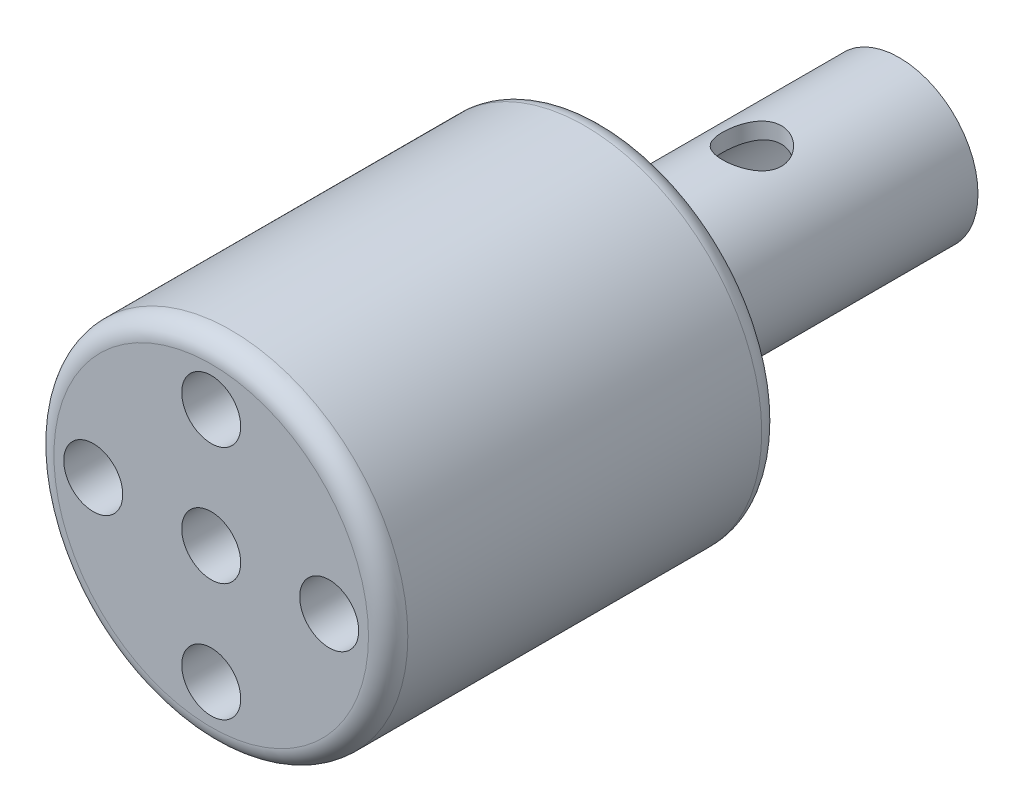
ISO-10303-21;
HEADER;
FILE_DESCRIPTION(('STEP AP214'),'2;1');
FILE_NAME('part.step','',(''),(''),'','','');
FILE_SCHEMA(('AUTOMOTIVE_DESIGN { 1 0 10303 214 1 1 1 1 }'));
ENDSEC;
DATA;
#1=APPLICATION_CONTEXT('core data for automotive mechanical design processes');
#2=APPLICATION_PROTOCOL_DEFINITION('international standard','automotive_design',2000,#1);
#3=PRODUCT_CONTEXT('',#1,'mechanical');
#4=PRODUCT('Part','Part','',(#3));
#5=PRODUCT_RELATED_PRODUCT_CATEGORY('part','',(#4));
#6=PRODUCT_DEFINITION_FORMATION('','',#4);
#7=PRODUCT_DEFINITION_CONTEXT('part definition',#1,'design');
#8=PRODUCT_DEFINITION('design','',#6,#7);
#9=PRODUCT_DEFINITION_SHAPE('','',#8);
#10=(LENGTH_UNIT() NAMED_UNIT(*) SI_UNIT(.MILLI.,.METRE.));
#11=(NAMED_UNIT(*) PLANE_ANGLE_UNIT() SI_UNIT($,.RADIAN.));
#12=(NAMED_UNIT(*) SI_UNIT($,.STERADIAN.) SOLID_ANGLE_UNIT());
#13=UNCERTAINTY_MEASURE_WITH_UNIT(LENGTH_MEASURE(1.E-05),#10,'distance_accuracy_value','');
#14=(GEOMETRIC_REPRESENTATION_CONTEXT(3) GLOBAL_UNCERTAINTY_ASSIGNED_CONTEXT((#13)) GLOBAL_UNIT_ASSIGNED_CONTEXT((#10,
#11,#12)) REPRESENTATION_CONTEXT('',''));
#15=CARTESIAN_POINT('',(0.,0.,0.));
#16=DIRECTION('',(0.,0.,1.));
#17=DIRECTION('',(1.,0.,0.));
#18=AXIS2_PLACEMENT_3D('',#15,#16,#17);
#19=CARTESIAN_POINT('',(0.,0.,-15.));
#20=DIRECTION('',(0.,0.,1.));
#21=DIRECTION('',(1.,0.,0.));
#22=AXIS2_PLACEMENT_3D('',#19,#20,#21);
#23=CYLINDRICAL_SURFACE('',#22,4.);
#24=CARTESIAN_POINT('',(0.,0.,-0.25));
#25=DIRECTION('',(0.,0.,1.));
#26=DIRECTION('',(1.,0.,0.));
#27=AXIS2_PLACEMENT_3D('',#24,#25,#26);
#28=CIRCLE('',#27,4.);
#29=CARTESIAN_POINT('',(4.,0.,-0.25));
#30=VERTEX_POINT('',#29);
#31=EDGE_CURVE('E146',#30,#30,#28,.F.);
#32=ORIENTED_EDGE('',*,*,#31,.T.);
#33=EDGE_LOOP('',(#32));
#34=FACE_BOUND('',#33,.T.);
#35=CARTESIAN_POINT('',(0.,0.,-15.));
#36=DIRECTION('',(0.,0.,-1.));
#37=DIRECTION('',(-1.,0.,0.));
#38=AXIS2_PLACEMENT_3D('',#35,#36,#37);
#39=CIRCLE('',#38,4.);
#40=CARTESIAN_POINT('',(-4.,0.,-15.));
#41=VERTEX_POINT('',#40);
#42=EDGE_CURVE('E173',#41,#41,#39,.T.);
#43=ORIENTED_EDGE('',*,*,#42,.F.);
#44=EDGE_LOOP('',(#43));
#45=FACE_BOUND('',#44,.T.);
#46=CARTESIAN_POINT('',(0.,-4.,-9.));
#47=CARTESIAN_POINT('',(0.0812350589378533,-4.00000217456151,-9.00000290230311));
#48=CARTESIAN_POINT('',(0.162450241781792,-3.99750379283184,-8.99338023975162));
#49=CARTESIAN_POINT('',(0.322453452352361,-3.98778696006928,-8.96717180473007));
#50=CARTESIAN_POINT('',(0.401241827987616,-3.98056918893993,-8.94758789952943));
#51=CARTESIAN_POINT('',(0.55406078499088,-3.96218832391545,-8.89624699822824));
#52=CARTESIAN_POINT('',(0.628100224162279,-3.9510328434944,-8.86451348317821));
#53=CARTESIAN_POINT('',(0.769799310160255,-3.92588767765353,-8.78989358698418));
#54=CARTESIAN_POINT('',(0.83745723917788,-3.91189723227548,-8.74700421445585));
#55=CARTESIAN_POINT('',(0.967346417045825,-3.88186246971217,-8.64938746892909));
#56=CARTESIAN_POINT('',(1.02927073015119,-3.86576002583566,-8.5942697377406));
#57=CARTESIAN_POINT('',(1.14324421474363,-3.83360220871327,-8.47458956534116));
#58=CARTESIAN_POINT('',(1.19529036359203,-3.81754685135033,-8.41002424391213));
#59=CARTESIAN_POINT('',(1.28998202215985,-3.78662470617731,-8.27028253247679));
#60=CARTESIAN_POINT('',(1.3321939319576,-3.77182648820818,-8.19479563345418));
#61=CARTESIAN_POINT('',(1.40318646334084,-3.74599860237433,-8.03715164583148));
#62=CARTESIAN_POINT('',(1.43197244961239,-3.73496742975881,-7.9549972368449));
#63=CARTESIAN_POINT('',(1.47408431017549,-3.71854412824136,-7.7898832597418));
#64=CARTESIAN_POINT('',(1.48799593218558,-3.71293924350838,-7.70709496156456));
#65=CARTESIAN_POINT('',(1.50179556531648,-3.70738061461215,-7.54018384200616));
#66=CARTESIAN_POINT('',(1.50168936802631,-3.70742453659305,-7.45606158612553));
#67=CARTESIAN_POINT('',(1.48790429610018,-3.71297511632055,-7.29423047478704));
#68=CARTESIAN_POINT('',(1.47503808509004,-3.71815468871122,-7.21643909395582));
#69=CARTESIAN_POINT('',(1.4374416786833,-3.73284938059529,-7.06421284959468));
#70=CARTESIAN_POINT('',(1.41270969663258,-3.74236515298863,-6.98977849338612));
#71=CARTESIAN_POINT('',(1.35163748571904,-3.76485702190253,-6.84472293227177));
#72=CARTESIAN_POINT('',(1.31508648737101,-3.77789517988166,-6.7742005138787));
#73=CARTESIAN_POINT('',(1.23156073762698,-3.80594210139319,-6.64005426240903));
#74=CARTESIAN_POINT('',(1.18458238728897,-3.82095154457158,-6.5764328224803));
#75=CARTESIAN_POINT('',(1.07781780766549,-3.85248038859113,-6.45339633634912));
#76=CARTESIAN_POINT('',(1.01738298716956,-3.86903347455671,-6.39455135925191));
#77=CARTESIAN_POINT('',(0.887312590819021,-3.90091728164085,-6.2876620337942));
#78=CARTESIAN_POINT('',(0.817675603497365,-3.91624781465952,-6.23961934539433));
#79=CARTESIAN_POINT('',(0.66972343699242,-3.9442639480908,-6.15506960293748));
#80=CARTESIAN_POINT('',(0.591290713844719,-3.95690498259616,-6.11875241877894));
#81=CARTESIAN_POINT('',(0.428836850524583,-3.97778718326962,-6.06001739572996));
#82=CARTESIAN_POINT('',(0.344818210845768,-3.98603030341493,-6.03759338343888));
#83=CARTESIAN_POINT('',(0.178375243148666,-3.99684443228065,-6.00837721245806));
#84=CARTESIAN_POINT('',(0.0961036195622103,-3.99969369025686,-6.00081739361749));
#85=CARTESIAN_POINT('',(-0.0685724752550234,-4.00025893700126,-5.99930893610008));
#86=CARTESIAN_POINT('',(-0.150976912983372,-3.99797606386863,-6.00535727968322));
#87=CARTESIAN_POINT('',(-0.310262048561858,-3.98871709772643,-6.03031004230867));
#88=CARTESIAN_POINT('',(-0.387233328007335,-3.98192470962305,-6.04871154373708));
#89=CARTESIAN_POINT('',(-0.53694175495722,-3.96451477091717,-6.09718607254732));
#90=CARTESIAN_POINT('',(-0.609678350347534,-3.9538967228203,-6.12726061794804));
#91=CARTESIAN_POINT('',(-0.751247765110155,-3.92949624407682,-6.19918641243948));
#92=CARTESIAN_POINT('',(-0.819903083557795,-3.91563000209348,-6.24135772922339));
#93=CARTESIAN_POINT('',(-0.949392711726625,-3.88626671564664,-6.33591810317156));
#94=CARTESIAN_POINT('',(-1.01022412027045,-3.87076907009516,-6.38831093254515));
#95=CARTESIAN_POINT('',(-1.12603079874454,-3.8387332949099,-6.50540412212427));
#96=CARTESIAN_POINT('',(-1.18046154123568,-3.82218696503729,-6.5706421827727));
#97=CARTESIAN_POINT('',(-1.27771050031903,-3.79078815746854,-6.70965138470766));
#98=CARTESIAN_POINT('',(-1.32052767414518,-3.77593583194399,-6.7834232913885));
#99=CARTESIAN_POINT('',(-1.39337773518998,-3.74966829822463,-6.93801598677231));
#100=CARTESIAN_POINT('',(-1.42335685446918,-3.73826760328493,-7.01886474591044));
#101=CARTESIAN_POINT('',(-1.46907883466889,-3.72054032891005,-7.18500976368782));
#102=CARTESIAN_POINT('',(-1.48483050305535,-3.71421061057491,-7.27030323619812));
#103=CARTESIAN_POINT('',(-1.50086347097839,-3.70775894792573,-7.43701615954111));
#104=CARTESIAN_POINT('',(-1.50207331495837,-3.70726444523341,-7.51833263171688));
#105=CARTESIAN_POINT('',(-1.49136715641593,-3.71158412745292,-7.67994531627616));
#106=CARTESIAN_POINT('',(-1.47945239850123,-3.71639780898899,-7.76024162467158));
#107=CARTESIAN_POINT('',(-1.44355815630242,-3.73048141585432,-7.91504722671655));
#108=CARTESIAN_POINT('',(-1.41995798316524,-3.73961085376663,-7.98965834624534));
#109=CARTESIAN_POINT('',(-1.3616969677992,-3.76121548297845,-8.13390550849442));
#110=CARTESIAN_POINT('',(-1.32703332944945,-3.77369151995215,-8.20354028807014));
#111=CARTESIAN_POINT('',(-1.24552075938154,-3.80139723903965,-8.33982678969763));
#112=CARTESIAN_POINT('',(-1.1981283280301,-3.81673698440964,-8.40613079679991));
#113=CARTESIAN_POINT('',(-1.09334485729906,-3.84806246757177,-8.5301415609712));
#114=CARTESIAN_POINT('',(-1.03595064012808,-3.86404840943145,-8.58784557478675));
#115=CARTESIAN_POINT('',(-0.909080396784623,-3.89590424609881,-8.69620195582184));
#116=CARTESIAN_POINT('',(-0.839118644212992,-3.91172104900645,-8.74630375343467));
#117=CARTESIAN_POINT('',(-0.691213223200821,-3.94054514457031,-8.83402265527655));
#118=CARTESIAN_POINT('',(-0.613268934090622,-3.95355221851559,-8.87163878773637));
#119=CARTESIAN_POINT('',(-0.447999082002312,-3.9757429260668,-8.93437682904833));
#120=CARTESIAN_POINT('',(-0.360413422234208,-3.98473657158356,-8.9588870646019));
#121=CARTESIAN_POINT('',(-0.181875733606382,-3.99686242179587,-8.99169295992068));
#122=CARTESIAN_POINT('',(-0.0909254163648587,-3.99999756603967,-8.99999675148732));
#123=CARTESIAN_POINT('',(0.,-4.,-9.));
#124=B_SPLINE_CURVE_WITH_KNOTS('',3,(#46,#47,#48,#49,#50,#51,#52,#53,#54,#55,#56,#57,#58,#59,
#60,#61,#62,#63,#64,#65,#66,#67,#68,#69,#70,#71,#72,#73,#74,#75,#76,#77,#78,#79,#80,#81,#82,#83,
#84,#85,#86,#87,#88,#89,#90,#91,#92,#93,#94,#95,#96,#97,#98,#99,#100,#101,#102,#103,#104,#105,
#106,#107,#108,#109,#110,#111,#112,#113,#114,#115,#116,#117,#118,#119,#120,#121,#122,#123),
.UNSPECIFIED.,.T.,.F.,(4,2,2,2,2,2,2,2,2,2,2,2,2,2,2,2,2,2,2,2,2,2,2,2,2,2,2,2,2,2,2,2,2,2,2,2,
2,2,4),(0.,0.243369801560559,0.48670454953046,0.729571369213574,0.972503379609489,
1.22473618582715,1.47704604925622,1.73896674501658,2.00078269352134,2.25185874416901,
2.50283106079707,2.73878345119971,2.97477138060589,3.21522408387018,3.45575990744258,
3.71246153335813,3.96920257905066,4.22991375286075,4.49050899698846,4.73725019635925,
4.9839366839052,5.2211443792384,5.45838293254453,5.70259221859599,5.94689180019868,
6.20536519455657,6.46386178920141,6.72343066727204,6.98283874956507,7.22558763480252,
7.46831350211259,7.70363142426533,7.93900886656506,8.18672471884271,8.43451941997062,
8.69572329654039,8.95694749805102,9.22948515032042,9.50188601796127),.UNSPECIFIED.);
#125=CARTESIAN_POINT('',(0.,-4.,-9.));
#126=VERTEX_POINT('',#125);
#127=EDGE_CURVE('E78',#126,#126,#124,.T.);
#128=ORIENTED_EDGE('',*,*,#127,.F.);
#129=EDGE_LOOP('',(#128));
#130=FACE_BOUND('',#129,.T.);
#131=CARTESIAN_POINT('',(0.,4.,-9.));
#132=CARTESIAN_POINT('',(-0.0812350589378524,4.00000217456151,-9.00000290230311));
#133=CARTESIAN_POINT('',(-0.162450241781792,3.99750379283184,-8.99338023975162));
#134=CARTESIAN_POINT('',(-0.32245345235236,3.98778696006928,-8.96717180473007));
#135=CARTESIAN_POINT('',(-0.401241827987615,3.98056918893993,-8.94758789952943));
#136=CARTESIAN_POINT('',(-0.554060784990878,3.96218832391545,-8.89624699822824));
#137=CARTESIAN_POINT('',(-0.628100224162277,3.9510328434944,-8.86451348317821));
#138=CARTESIAN_POINT('',(-0.769799310160253,3.92588767765353,-8.78989358698418));
#139=CARTESIAN_POINT('',(-0.837457239177879,3.91189723227548,-8.74700421445585));
#140=CARTESIAN_POINT('',(-0.967346417045825,3.88186246971217,-8.64938746892909));
#141=CARTESIAN_POINT('',(-1.02927073015119,3.86576002583566,-8.5942697377406));
#142=CARTESIAN_POINT('',(-1.14324421474363,3.83360220871327,-8.47458956534116));
#143=CARTESIAN_POINT('',(-1.19529036359203,3.81754685135033,-8.41002424391213));
#144=CARTESIAN_POINT('',(-1.28998202215985,3.78662470617731,-8.27028253247679));
#145=CARTESIAN_POINT('',(-1.3321939319576,3.77182648820818,-8.19479563345418));
#146=CARTESIAN_POINT('',(-1.40318646334084,3.74599860237433,-8.03715164583148));
#147=CARTESIAN_POINT('',(-1.43197244961239,3.73496742975881,-7.9549972368449));
#148=CARTESIAN_POINT('',(-1.47408431017549,3.71854412824136,-7.7898832597418));
#149=CARTESIAN_POINT('',(-1.48799593218558,3.71293924350838,-7.70709496156456));
#150=CARTESIAN_POINT('',(-1.50179556531648,3.70738061461215,-7.54018384200616));
#151=CARTESIAN_POINT('',(-1.5016893680263,3.70742453659305,-7.45606158612553));
#152=CARTESIAN_POINT('',(-1.48790429610018,3.71297511632055,-7.29423047478704));
#153=CARTESIAN_POINT('',(-1.47503808509003,3.71815468871122,-7.21643909395582));
#154=CARTESIAN_POINT('',(-1.4374416786833,3.73284938059529,-7.06421284959468));
#155=CARTESIAN_POINT('',(-1.41270969663258,3.74236515298863,-6.98977849338612));
#156=CARTESIAN_POINT('',(-1.35163748571904,3.76485702190253,-6.84472293227177));
#157=CARTESIAN_POINT('',(-1.31508648737101,3.77789517988166,-6.7742005138787));
#158=CARTESIAN_POINT('',(-1.23156073762698,3.80594210139319,-6.64005426240903));
#159=CARTESIAN_POINT('',(-1.18458238728897,3.82095154457158,-6.5764328224803));
#160=CARTESIAN_POINT('',(-1.07781780766549,3.85248038859113,-6.45339633634912));
#161=CARTESIAN_POINT('',(-1.01738298716955,3.86903347455671,-6.39455135925191));
#162=CARTESIAN_POINT('',(-0.88731259081902,3.90091728164085,-6.2876620337942));
#163=CARTESIAN_POINT('',(-0.817675603497363,3.91624781465952,-6.23961934539433));
#164=CARTESIAN_POINT('',(-0.669723436992419,3.9442639480908,-6.15506960293748));
#165=CARTESIAN_POINT('',(-0.591290713844718,3.95690498259616,-6.11875241877894));
#166=CARTESIAN_POINT('',(-0.428836850524582,3.97778718326962,-6.06001739572996));
#167=CARTESIAN_POINT('',(-0.344818210845767,3.98603030341493,-6.03759338343888));
#168=CARTESIAN_POINT('',(-0.178375243148665,3.99684443228065,-6.00837721245806));
#169=CARTESIAN_POINT('',(-0.0961036195622087,3.99969369025686,-6.00081739361749));
#170=CARTESIAN_POINT('',(0.0685724752550248,4.00025893700126,-5.99930893610008));
#171=CARTESIAN_POINT('',(0.150976912983373,3.99797606386863,-6.00535727968322));
#172=CARTESIAN_POINT('',(0.31026204856186,3.98871709772643,-6.03031004230867));
#173=CARTESIAN_POINT('',(0.387233328007337,3.98192470962305,-6.04871154373709));
#174=CARTESIAN_POINT('',(0.536941754957222,3.96451477091717,-6.09718607254732));
#175=CARTESIAN_POINT('',(0.609678350347535,3.9538967228203,-6.12726061794804));
#176=CARTESIAN_POINT('',(0.751247765110156,3.92949624407681,-6.19918641243947));
#177=CARTESIAN_POINT('',(0.819903083557796,3.91563000209348,-6.24135772922339));
#178=CARTESIAN_POINT('',(0.949392711726626,3.88626671564664,-6.33591810317156));
#179=CARTESIAN_POINT('',(1.01022412027045,3.87076907009516,-6.38831093254515));
#180=CARTESIAN_POINT('',(1.12603079874454,3.8387332949099,-6.50540412212427));
#181=CARTESIAN_POINT('',(1.18046154123569,3.82218696503729,-6.5706421827727));
#182=CARTESIAN_POINT('',(1.27771050031903,3.79078815746854,-6.70965138470766));
#183=CARTESIAN_POINT('',(1.32052767414518,3.77593583194399,-6.7834232913885));
#184=CARTESIAN_POINT('',(1.39337773518998,3.74966829822463,-6.93801598677231));
#185=CARTESIAN_POINT('',(1.42335685446918,3.73826760328493,-7.01886474591044));
#186=CARTESIAN_POINT('',(1.46907883466889,3.72054032891005,-7.18500976368782));
#187=CARTESIAN_POINT('',(1.48483050305535,3.71421061057491,-7.27030323619812));
#188=CARTESIAN_POINT('',(1.50086347097839,3.70775894792573,-7.43701615954111));
#189=CARTESIAN_POINT('',(1.50207331495837,3.70726444523341,-7.51833263171688));
#190=CARTESIAN_POINT('',(1.49136715641593,3.71158412745292,-7.67994531627616));
#191=CARTESIAN_POINT('',(1.47945239850124,3.71639780898899,-7.76024162467158));
#192=CARTESIAN_POINT('',(1.44355815630242,3.73048141585432,-7.91504722671655));
#193=CARTESIAN_POINT('',(1.41995798316524,3.73961085376663,-7.98965834624534));
#194=CARTESIAN_POINT('',(1.3616969677992,3.76121548297845,-8.13390550849442));
#195=CARTESIAN_POINT('',(1.32703332944945,3.77369151995215,-8.20354028807014));
#196=CARTESIAN_POINT('',(1.24552075938154,3.80139723903965,-8.33982678969763));
#197=CARTESIAN_POINT('',(1.1981283280301,3.81673698440964,-8.40613079679991));
#198=CARTESIAN_POINT('',(1.09334485729906,3.84806246757177,-8.5301415609712));
#199=CARTESIAN_POINT('',(1.03595064012808,3.86404840943145,-8.58784557478675));
#200=CARTESIAN_POINT('',(0.909080396784624,3.89590424609881,-8.69620195582184));
#201=CARTESIAN_POINT('',(0.839118644212993,3.91172104900645,-8.74630375343467));
#202=CARTESIAN_POINT('',(0.691213223200821,3.9405451445703,-8.83402265527656));
#203=CARTESIAN_POINT('',(0.613268934090621,3.95355221851559,-8.87163878773637));
#204=CARTESIAN_POINT('',(0.447999082002312,3.9757429260668,-8.93437682904833));
#205=CARTESIAN_POINT('',(0.360413422234209,3.98473657158356,-8.9588870646019));
#206=CARTESIAN_POINT('',(0.181875733606383,3.99686242179587,-8.99169295992068));
#207=CARTESIAN_POINT('',(0.0909254163648596,3.99999756603967,-8.99999675148732));
#208=CARTESIAN_POINT('',(0.,4.,-9.));
#209=B_SPLINE_CURVE_WITH_KNOTS('',3,(#131,#132,#133,#134,#135,#136,#137,#138,#139,#140,#141,
#142,#143,#144,#145,#146,#147,#148,#149,#150,#151,#152,#153,#154,#155,#156,#157,#158,#159,#160,
#161,#162,#163,#164,#165,#166,#167,#168,#169,#170,#171,#172,#173,#174,#175,#176,#177,#178,#179,
#180,#181,#182,#183,#184,#185,#186,#187,#188,#189,#190,#191,#192,#193,#194,#195,#196,#197,#198,
#199,#200,#201,#202,#203,#204,#205,#206,#207,#208),.UNSPECIFIED.,.T.,.F.,(4,2,2,2,2,2,2,2,2,2,2,
2,2,2,2,2,2,2,2,2,2,2,2,2,2,2,2,2,2,2,2,2,2,2,2,2,2,2,4),(0.,0.24336980156056,0.48670454953046,
0.729571369213572,0.972503379609489,1.22473618582715,1.47704604925622,1.73896674501659,
2.00078269352134,2.25185874416901,2.50283106079707,2.73878345119971,2.97477138060589,
3.21522408387018,3.45575990744258,3.71246153335813,3.96920257905066,4.22991375286075,
4.49050899698846,4.73725019635925,4.9839366839052,5.2211443792384,5.45838293254453,
5.70259221859599,5.94689180019868,6.20536519455658,6.46386178920141,6.72343066727204,
6.98283874956507,7.22558763480252,7.46831350211259,7.70363142426533,7.93900886656506,
8.18672471884271,8.43451941997062,8.69572329654039,8.95694749805102,9.22948515032042,
9.50188601796127),.UNSPECIFIED.);
#210=CARTESIAN_POINT('',(0.,4.,-9.));
#211=VERTEX_POINT('',#210);
#212=EDGE_CURVE('E85',#211,#211,#209,.T.);
#213=ORIENTED_EDGE('',*,*,#212,.F.);
#214=EDGE_LOOP('',(#213));
#215=FACE_BOUND('',#214,.T.);
#216=ADVANCED_FACE('F35',(#34,#45,#130,#215),#23,.T.);
#217=CARTESIAN_POINT('',(0.,0.,-15.));
#218=DIRECTION('',(0.,0.,1.));
#219=DIRECTION('',(1.,0.,0.));
#220=AXIS2_PLACEMENT_3D('',#217,#218,#219);
#221=CYLINDRICAL_SURFACE('',#220,3.19);
#222=CARTESIAN_POINT('',(0.,-3.19,-9.));
#223=CARTESIAN_POINT('',(0.079409989552945,-3.18999627113844,-8.99999557644007));
#224=CARTESIAN_POINT('',(0.15893096364924,-3.187002250801,-8.99365690112522));
#225=CARTESIAN_POINT('',(0.31565730701504,-3.17532170274528,-8.96856626181392));
#226=CARTESIAN_POINT('',(0.392857234738697,-3.16662274629125,-8.94978719435542));
#227=CARTESIAN_POINT('',(0.542429255815469,-3.14445000359866,-8.90069333966326));
#228=CARTESIAN_POINT('',(0.614818158583422,-3.13099400706472,-8.87042150071482));
#229=CARTESIAN_POINT('',(0.753398847896799,-3.10056937792712,-8.79940662508241));
#230=CARTESIAN_POINT('',(0.819591611692242,-3.08360130060618,-8.7586652434553));
#231=CARTESIAN_POINT('',(0.948025158837623,-3.04664697875585,-8.6652879836265));
#232=CARTESIAN_POINT('',(1.00984458184224,-3.02654567978176,-8.61211867349204));
#233=CARTESIAN_POINT('',(1.1240685551614,-2.9860090795079,-8.49653367607316));
#234=CARTESIAN_POINT('',(1.17646680834088,-2.96557356469775,-8.43411185485564));
#235=CARTESIAN_POINT('',(1.27383618163852,-2.92513327586192,-8.29679661115047));
#236=CARTESIAN_POINT('',(1.31808211223074,-2.90524742235817,-8.22134999755529));
#237=CARTESIAN_POINT('',(1.39307180728982,-2.87004862267512,-8.06303485140144));
#238=CARTESIAN_POINT('',(1.42382430668892,-2.85473272021281,-7.98017116222401));
#239=CARTESIAN_POINT('',(1.46910337911277,-2.83168711934531,-7.81418060196727));
#240=CARTESIAN_POINT('',(1.4844462339175,-2.82357875500411,-7.73133137918008));
#241=CARTESIAN_POINT('',(1.50099451452456,-2.81482026612183,-7.56386949785784));
#242=CARTESIAN_POINT('',(1.50221124068393,-2.81416418005522,-7.47925830312624));
#243=CARTESIAN_POINT('',(1.49107646793938,-2.82007331384391,-7.31999094433373));
#244=CARTESIAN_POINT('',(1.48010560620109,-2.82590381826648,-7.24520482502077));
#245=CARTESIAN_POINT('',(1.44727051735526,-2.84285874905075,-7.09869378613376));
#246=CARTESIAN_POINT('',(1.42540342821439,-2.85398456625954,-7.02696967621218));
#247=CARTESIAN_POINT('',(1.37097025348215,-2.88053323389214,-6.88661540015755));
#248=CARTESIAN_POINT('',(1.33816842309293,-2.89604951298145,-6.81809515312693));
#249=CARTESIAN_POINT('',(1.26297055634675,-2.92962435427646,-6.68722226705974));
#250=CARTESIAN_POINT('',(1.22057030795016,-2.94768403127372,-6.62487235304352));
#251=CARTESIAN_POINT('',(1.12190556403063,-2.98672718526905,-6.50086107995508));
#252=CARTESIAN_POINT('',(1.06462709829118,-3.00781330284032,-6.44003611244838));
#253=CARTESIAN_POINT('',(0.940543581891684,-3.04889294269297,-6.32853149001125));
#254=CARTESIAN_POINT('',(0.873734956010449,-3.06888605102281,-6.2778556597393));
#255=CARTESIAN_POINT('',(0.729347296347792,-3.10643044916602,-6.18637299338124));
#256=CARTESIAN_POINT('',(0.651463152277229,-3.12386531548051,-6.14599618785831));
#257=CARTESIAN_POINT('',(0.488977783789756,-3.15337886491314,-6.07922553446264));
#258=CARTESIAN_POINT('',(0.404381346739075,-3.16546132571641,-6.0528218219224));
#259=CARTESIAN_POINT('',(0.237777652887046,-3.18214255261011,-6.01670434101112));
#260=CARTESIAN_POINT('',(0.156062718443793,-3.1872405501038,-6.00587406355721));
#261=CARTESIAN_POINT('',(-0.00817217474352894,-3.19104514394559,-5.99777342170754));
#262=CARTESIAN_POINT('',(-0.0906918013790861,-3.18975427419525,-6.00049768142166));
#263=CARTESIAN_POINT('',(-0.248361908033892,-3.18123234365266,-6.01871860884991));
#264=CARTESIAN_POINT('',(-0.323636801580449,-3.17440321606373,-6.03335128102404));
#265=CARTESIAN_POINT('',(-0.470537321947743,-3.15597492925198,-6.07367663786381));
#266=CARTESIAN_POINT('',(-0.542162523192314,-3.14437521517399,-6.09937060905816));
#267=CARTESIAN_POINT('',(-0.682230579654231,-3.11703567824444,-6.16185831576214));
#268=CARTESIAN_POINT('',(-0.750509757255624,-3.10118037874647,-6.19896667550093));
#269=CARTESIAN_POINT('',(-0.880112926352786,-3.06692059887379,-6.28288526114865));
#270=CARTESIAN_POINT('',(-0.941433845430856,-3.04851500032047,-6.32969974720175));
#271=CARTESIAN_POINT('',(-1.06114642900146,-3.00905059931716,-6.43653240603979));
#272=CARTESIAN_POINT('',(-1.11879234470125,-2.9879014220003,-6.49735465075025));
#273=CARTESIAN_POINT('',(-1.22334992809514,-2.94663896387866,-6.62798015846678));
#274=CARTESIAN_POINT('',(-1.27025624231265,-2.92652620356121,-6.69778787358322));
#275=CARTESIAN_POINT('',(-1.35344213134287,-2.88902274574907,-6.84749062102414));
#276=CARTESIAN_POINT('',(-1.38930636296844,-2.87174779260433,-6.92764785109297));
#277=CARTESIAN_POINT('',(-1.44666195847281,-2.84329233318655,-7.09394337835352));
#278=CARTESIAN_POINT('',(-1.46816951686347,-2.83210496268489,-7.1800748150323));
#279=CARTESIAN_POINT('',(-1.49440389991488,-2.81834286378908,-7.34745994120132));
#280=CARTESIAN_POINT('',(-1.50047849363176,-2.81507762746794,-7.4284452353621));
#281=CARTESIAN_POINT('',(-1.49946295606118,-2.81561960261841,-7.59029780742269));
#282=CARTESIAN_POINT('',(-1.49237669305751,-2.81942473594307,-7.67116511301058));
#283=CARTESIAN_POINT('',(-1.46646020993388,-2.83298072200043,-7.82413198989846));
#284=CARTESIAN_POINT('',(-1.44855188395165,-2.84226361241884,-7.89643393714051));
#285=CARTESIAN_POINT('',(-1.40254612573862,-2.8652437364715,-8.03696851689714));
#286=CARTESIAN_POINT('',(-1.37444564021955,-2.8789422927798,-8.10519992285031));
#287=CARTESIAN_POINT('',(-1.30673369777391,-2.91033075620875,-8.24064603803551));
#288=CARTESIAN_POINT('',(-1.26648116477096,-2.92822547171948,-8.30749157731467));
#289=CARTESIAN_POINT('',(-1.17638150189002,-2.9655697393921,-8.43389350268241));
#290=CARTESIAN_POINT('',(-1.12652982523851,-2.98502002580995,-8.49344641255532));
#291=CARTESIAN_POINT('',(-1.01262883141259,-3.02567327168209,-8.60989920257813));
#292=CARTESIAN_POINT('',(-0.947647992087299,-3.04685152034022,-8.6659014015175));
#293=CARTESIAN_POINT('',(-0.808527824478944,-3.08668306446603,-8.76634992143049));
#294=CARTESIAN_POINT('',(-0.734384121619138,-3.10533514490291,-8.81079069100952));
#295=CARTESIAN_POINT('',(-0.579051357629451,-3.13800429498616,-8.88640922140088));
#296=CARTESIAN_POINT('',(-0.49789337967727,-3.15204061053258,-8.91764221341707));
#297=CARTESIAN_POINT('',(-0.330752327249992,-3.17391754383834,-8.96564523474594));
#298=CARTESIAN_POINT('',(-0.244784364248636,-3.18177651391047,-8.9824581185175));
#299=CARTESIAN_POINT('',(-0.131761083737596,-3.18738732008092,-8.99443623398197));
#300=CARTESIAN_POINT('',(-0.105465590549063,-3.18836505763955,-8.99652031460554));
#301=CARTESIAN_POINT('',(-0.0527841544514799,-3.18967202426905,-8.99930294757086));
#302=CARTESIAN_POINT('',(-0.0263982096355936,-3.19000123958295,-9.00000147052106));
#303=CARTESIAN_POINT('',(0.,-3.19,-9.));
#304=B_SPLINE_CURVE_WITH_KNOTS('',3,(#222,#223,#224,#225,#226,#227,#228,#229,#230,#231,#232,
#233,#234,#235,#236,#237,#238,#239,#240,#241,#242,#243,#244,#245,#246,#247,#248,#249,#250,#251,
#252,#253,#254,#255,#256,#257,#258,#259,#260,#261,#262,#263,#264,#265,#266,#267,#268,#269,#270,
#271,#272,#273,#274,#275,#276,#277,#278,#279,#280,#281,#282,#283,#284,#285,#286,#287,#288,#289,
#290,#291,#292,#293,#294,#295,#296,#297,#298,#299,#300,#301,#302,#303),.UNSPECIFIED.,.T.,.F.,(4,
2,2,2,2,2,2,2,2,2,2,2,2,2,2,2,2,2,2,2,2,2,2,2,2,2,2,2,2,2,2,2,2,2,2,2,2,2,2,2,4),(0.,
0.238122164246177,0.47676483091643,0.714524335002078,0.952246276445132,1.20312251440694,
1.45416582034389,1.72189595456079,1.98945251785417,2.24194065687106,2.49422680120376,
2.72060290060174,2.9470384919422,3.17871097367318,3.41048531716965,3.6678546721825,
3.92532083397882,4.19222811542783,4.4589467145355,4.70538247097952,4.95172049587407,
5.18162859974826,5.41156345123352,5.64851091127943,5.88556259162709,6.14370026219296,
6.40196633042782,6.66900989970098,6.93575172905481,7.17824437944545,7.4206657668507,
7.64488213395491,7.86916572561604,8.10836024817714,8.34766834863884,8.61150662282405,
8.87547135008045,9.13832106626531,9.4003868976172,9.47954401005064,9.55870280160873),.UNSPECIFIED.);
#305=CARTESIAN_POINT('',(0.,-3.19,-9.));
#306=VERTEX_POINT('',#305);
#307=EDGE_CURVE('E56',#306,#306,#304,.T.);
#308=ORIENTED_EDGE('',*,*,#307,.T.);
#309=EDGE_LOOP('',(#308));
#310=FACE_BOUND('',#309,.T.);
#311=CARTESIAN_POINT('',(0.,0.,-15.));
#312=DIRECTION('',(0.,0.,-1.));
#313=DIRECTION('',(-1.,0.,0.));
#314=AXIS2_PLACEMENT_3D('',#311,#312,#313);
#315=CIRCLE('',#314,3.19);
#316=CARTESIAN_POINT('',(-3.19,0.,-15.));
#317=VERTEX_POINT('',#316);
#318=EDGE_CURVE('E178',#317,#317,#315,.T.);
#319=ORIENTED_EDGE('',*,*,#318,.T.);
#320=EDGE_LOOP('',(#319));
#321=FACE_BOUND('',#320,.T.);
#322=CARTESIAN_POINT('',(0.,0.,0.));
#323=DIRECTION('',(0.,0.,-1.));
#324=DIRECTION('',(-1.,0.,0.));
#325=AXIS2_PLACEMENT_3D('',#322,#323,#324);
#326=CIRCLE('',#325,3.19);
#327=CARTESIAN_POINT('',(-3.19,0.,0.));
#328=VERTEX_POINT('',#327);
#329=EDGE_CURVE('E179',#328,#328,#326,.T.);
#330=ORIENTED_EDGE('',*,*,#329,.F.);
#331=EDGE_LOOP('',(#330));
#332=FACE_BOUND('',#331,.T.);
#333=CARTESIAN_POINT('',(0.,3.19,-9.));
#334=CARTESIAN_POINT('',(-0.0794099895529441,3.18999627113844,-8.99999557644007));
#335=CARTESIAN_POINT('',(-0.158930963649239,3.187002250801,-8.99365690112522));
#336=CARTESIAN_POINT('',(-0.315657307015039,3.17532170274528,-8.96856626181392));
#337=CARTESIAN_POINT('',(-0.392857234738696,3.16662274629125,-8.94978719435542));
#338=CARTESIAN_POINT('',(-0.542429255815468,3.14445000359866,-8.90069333966326));
#339=CARTESIAN_POINT('',(-0.614818158583421,3.13099400706472,-8.87042150071482));
#340=CARTESIAN_POINT('',(-0.753398847896799,3.10056937792712,-8.79940662508241));
#341=CARTESIAN_POINT('',(-0.819591611692241,3.08360130060618,-8.7586652434553));
#342=CARTESIAN_POINT('',(-0.948025158837623,3.04664697875585,-8.6652879836265));
#343=CARTESIAN_POINT('',(-1.00984458184224,3.02654567978176,-8.61211867349204));
#344=CARTESIAN_POINT('',(-1.1240685551614,2.9860090795079,-8.49653367607316));
#345=CARTESIAN_POINT('',(-1.17646680834088,2.96557356469775,-8.43411185485564));
#346=CARTESIAN_POINT('',(-1.27383618163852,2.92513327586192,-8.29679661115047));
#347=CARTESIAN_POINT('',(-1.31808211223074,2.90524742235817,-8.22134999755529));
#348=CARTESIAN_POINT('',(-1.39307180728982,2.87004862267512,-8.06303485140144));
#349=CARTESIAN_POINT('',(-1.42382430668892,2.85473272021281,-7.98017116222401));
#350=CARTESIAN_POINT('',(-1.46910337911277,2.83168711934531,-7.81418060196727));
#351=CARTESIAN_POINT('',(-1.48444623391749,2.82357875500411,-7.73133137918008));
#352=CARTESIAN_POINT('',(-1.50099451452456,2.81482026612183,-7.56386949785784));
#353=CARTESIAN_POINT('',(-1.50221124068393,2.81416418005522,-7.47925830312624));
#354=CARTESIAN_POINT('',(-1.49107646793937,2.82007331384391,-7.31999094433373));
#355=CARTESIAN_POINT('',(-1.48010560620109,2.82590381826648,-7.24520482502077));
#356=CARTESIAN_POINT('',(-1.44727051735526,2.84285874905075,-7.09869378613376));
#357=CARTESIAN_POINT('',(-1.42540342821439,2.85398456625954,-7.02696967621218));
#358=CARTESIAN_POINT('',(-1.37097025348215,2.88053323389214,-6.88661540015755));
#359=CARTESIAN_POINT('',(-1.33816842309292,2.89604951298145,-6.81809515312693));
#360=CARTESIAN_POINT('',(-1.26297055634675,2.92962435427646,-6.68722226705974));
#361=CARTESIAN_POINT('',(-1.22057030795016,2.94768403127372,-6.62487235304352));
#362=CARTESIAN_POINT('',(-1.12190556403062,2.98672718526905,-6.50086107995508));
#363=CARTESIAN_POINT('',(-1.06462709829118,3.00781330284032,-6.44003611244838));
#364=CARTESIAN_POINT('',(-0.940543581891684,3.04889294269297,-6.32853149001125));
#365=CARTESIAN_POINT('',(-0.873734956010449,3.06888605102281,-6.2778556597393));
#366=CARTESIAN_POINT('',(-0.72934729634779,3.10643044916602,-6.18637299338124));
#367=CARTESIAN_POINT('',(-0.651463152277228,3.12386531548051,-6.14599618785831));
#368=CARTESIAN_POINT('',(-0.488977783789755,3.15337886491314,-6.07922553446264));
#369=CARTESIAN_POINT('',(-0.404381346739074,3.16546132571641,-6.0528218219224));
#370=CARTESIAN_POINT('',(-0.237777652887045,3.18214255261011,-6.01670434101112));
#371=CARTESIAN_POINT('',(-0.156062718443793,3.1872405501038,-6.00587406355721));
#372=CARTESIAN_POINT('',(0.00817217474352926,3.19104514394559,-5.99777342170754));
#373=CARTESIAN_POINT('',(0.0906918013790865,3.18975427419525,-6.00049768142166));
#374=CARTESIAN_POINT('',(0.248361908033893,3.18123234365266,-6.01871860884991));
#375=CARTESIAN_POINT('',(0.32363680158045,3.17440321606373,-6.03335128102404));
#376=CARTESIAN_POINT('',(0.470537321947744,3.15597492925198,-6.07367663786381));
#377=CARTESIAN_POINT('',(0.542162523192314,3.14437521517399,-6.09937060905816));
#378=CARTESIAN_POINT('',(0.682230579654231,3.11703567824444,-6.16185831576214));
#379=CARTESIAN_POINT('',(0.750509757255625,3.10118037874647,-6.19896667550093));
#380=CARTESIAN_POINT('',(0.880112926352786,3.06692059887379,-6.28288526114865));
#381=CARTESIAN_POINT('',(0.941433845430857,3.04851500032047,-6.32969974720175));
#382=CARTESIAN_POINT('',(1.06114642900146,3.00905059931716,-6.43653240603979));
#383=CARTESIAN_POINT('',(1.11879234470125,2.9879014220003,-6.49735465075025));
#384=CARTESIAN_POINT('',(1.22334992809514,2.94663896387866,-6.62798015846678));
#385=CARTESIAN_POINT('',(1.27025624231265,2.92652620356121,-6.69778787358322));
#386=CARTESIAN_POINT('',(1.35344213134287,2.88902274574907,-6.84749062102414));
#387=CARTESIAN_POINT('',(1.38930636296844,2.87174779260433,-6.92764785109298));
#388=CARTESIAN_POINT('',(1.44666195847281,2.84329233318655,-7.09394337835352));
#389=CARTESIAN_POINT('',(1.46816951686347,2.83210496268489,-7.1800748150323));
#390=CARTESIAN_POINT('',(1.49440389991488,2.81834286378908,-7.34745994120132));
#391=CARTESIAN_POINT('',(1.50047849363176,2.81507762746794,-7.4284452353621));
#392=CARTESIAN_POINT('',(1.49946295606118,2.81561960261841,-7.59029780742269));
#393=CARTESIAN_POINT('',(1.49237669305751,2.81942473594307,-7.67116511301058));
#394=CARTESIAN_POINT('',(1.46646020993389,2.83298072200043,-7.82413198989846));
#395=CARTESIAN_POINT('',(1.44855188395165,2.84226361241884,-7.89643393714051));
#396=CARTESIAN_POINT('',(1.40254612573862,2.8652437364715,-8.03696851689714));
#397=CARTESIAN_POINT('',(1.37444564021955,2.8789422927798,-8.10519992285031));
#398=CARTESIAN_POINT('',(1.30673369777391,2.91033075620875,-8.24064603803551));
#399=CARTESIAN_POINT('',(1.26648116477097,2.92822547171948,-8.30749157731467));
#400=CARTESIAN_POINT('',(1.17638150189002,2.9655697393921,-8.43389350268241));
#401=CARTESIAN_POINT('',(1.12652982523851,2.98502002580995,-8.49344641255532));
#402=CARTESIAN_POINT('',(1.01262883141259,3.02567327168209,-8.60989920257813));
#403=CARTESIAN_POINT('',(0.947647992087299,3.04685152034022,-8.6659014015175));
#404=CARTESIAN_POINT('',(0.808527824478945,3.08668306446603,-8.76634992143049));
#405=CARTESIAN_POINT('',(0.734384121619139,3.10533514490291,-8.81079069100952));
#406=CARTESIAN_POINT('',(0.579051357629453,3.13800429498616,-8.88640922140088));
#407=CARTESIAN_POINT('',(0.497893379677272,3.15204061053258,-8.91764221341707));
#408=CARTESIAN_POINT('',(0.330752327249994,3.17391754383834,-8.96564523474594));
#409=CARTESIAN_POINT('',(0.244784364248637,3.18177651391047,-8.9824581185175));
#410=CARTESIAN_POINT('',(0.131761083737598,3.18738732008092,-8.99443623398197));
#411=CARTESIAN_POINT('',(0.105465590549064,3.18836505763955,-8.99652031460554));
#412=CARTESIAN_POINT('',(0.0527841544514809,3.18967202426905,-8.99930294757086));
#413=CARTESIAN_POINT('',(0.0263982096355945,3.19000123958295,-9.00000147052106));
#414=CARTESIAN_POINT('',(0.,3.19,-9.));
#415=B_SPLINE_CURVE_WITH_KNOTS('',3,(#333,#334,#335,#336,#337,#338,#339,#340,#341,#342,#343,
#344,#345,#346,#347,#348,#349,#350,#351,#352,#353,#354,#355,#356,#357,#358,#359,#360,#361,#362,
#363,#364,#365,#366,#367,#368,#369,#370,#371,#372,#373,#374,#375,#376,#377,#378,#379,#380,#381,
#382,#383,#384,#385,#386,#387,#388,#389,#390,#391,#392,#393,#394,#395,#396,#397,#398,#399,#400,
#401,#402,#403,#404,#405,#406,#407,#408,#409,#410,#411,#412,#413,#414),.UNSPECIFIED.,.T.,.F.,(4,
2,2,2,2,2,2,2,2,2,2,2,2,2,2,2,2,2,2,2,2,2,2,2,2,2,2,2,2,2,2,2,2,2,2,2,2,2,2,2,4),(0.,
0.238122164246177,0.47676483091643,0.714524335002079,0.952246276445132,1.20312251440694,
1.4541658203439,1.72189595456079,1.98945251785417,2.24194065687106,2.49422680120375,
2.72060290060174,2.9470384919422,3.17871097367318,3.41048531716965,3.6678546721825,
3.92532083397882,4.19222811542783,4.4589467145355,4.70538247097952,4.95172049587406,
5.18162859974826,5.41156345123352,5.64851091127942,5.88556259162709,6.14370026219296,
6.40196633042782,6.66900989970098,6.93575172905481,7.17824437944545,7.4206657668507,
7.64488213395491,7.86916572561604,8.10836024817714,8.34766834863884,8.61150662282405,
8.87547135008044,9.13832106626531,9.4003868976172,9.47954401005064,9.55870280160873),.UNSPECIFIED.);
#416=CARTESIAN_POINT('',(0.,3.19,-9.));
#417=VERTEX_POINT('',#416);
#418=EDGE_CURVE('E39',#417,#417,#415,.T.);
#419=ORIENTED_EDGE('',*,*,#418,.T.);
#420=EDGE_LOOP('',(#419));
#421=FACE_BOUND('',#420,.T.);
#422=ADVANCED_FACE('F62',(#310,#321,#332,#421),#221,.F.);
#423=CARTESIAN_POINT('',(0.,0.,20.));
#424=DIRECTION('',(0.,0.,1.));
#425=DIRECTION('',(1.,0.,0.));
#426=AXIS2_PLACEMENT_3D('',#423,#424,#425);
#427=PLANE('',#426);
#428=CARTESIAN_POINT('',(0.,0.,20.));
#429=DIRECTION('',(0.,0.,1.));
#430=DIRECTION('',(1.,0.,0.));
#431=AXIS2_PLACEMENT_3D('',#428,#429,#430);
#432=CIRCLE('',#431,1.5);
#433=CARTESIAN_POINT('',(1.5,0.,20.));
#434=VERTEX_POINT('',#433);
#435=EDGE_CURVE('E86',#434,#434,#432,.T.);
#436=ORIENTED_EDGE('',*,*,#435,.F.);
#437=EDGE_LOOP('',(#436));
#438=FACE_BOUND('',#437,.T.);
#439=CARTESIAN_POINT('',(0.,0.,20.));
#440=DIRECTION('',(0.,0.,1.));
#441=DIRECTION('',(1.,0.,0.));
#442=AXIS2_PLACEMENT_3D('',#439,#440,#441);
#443=CIRCLE('',#442,8.);
#444=CARTESIAN_POINT('',(8.,0.,20.));
#445=VERTEX_POINT('',#444);
#446=EDGE_CURVE('E141',#445,#445,#443,.T.);
#447=ORIENTED_EDGE('',*,*,#446,.T.);
#448=EDGE_LOOP('',(#447));
#449=FACE_BOUND('',#448,.T.);
#450=CARTESIAN_POINT('',(2.82502588785234E-13,-6.,20.));
#451=DIRECTION('',(0.,0.,1.));
#452=DIRECTION('',(1.,0.,0.));
#453=AXIS2_PLACEMENT_3D('',#450,#451,#452);
#454=CIRCLE('',#453,1.5);
#455=CARTESIAN_POINT('',(1.50000000000028,-6.,20.));
#456=VERTEX_POINT('',#455);
#457=EDGE_CURVE('E161',#456,#456,#454,.T.);
#458=ORIENTED_EDGE('',*,*,#457,.F.);
#459=EDGE_LOOP('',(#458));
#460=FACE_BOUND('',#459,.T.);
#461=CARTESIAN_POINT('',(0.,6.,20.));
#462=DIRECTION('',(0.,0.,1.));
#463=DIRECTION('',(1.,0.,0.));
#464=AXIS2_PLACEMENT_3D('',#461,#462,#463);
#465=CIRCLE('',#464,1.5);
#466=CARTESIAN_POINT('',(1.5,6.,20.));
#467=VERTEX_POINT('',#466);
#468=EDGE_CURVE('E151',#467,#467,#465,.T.);
#469=ORIENTED_EDGE('',*,*,#468,.F.);
#470=EDGE_LOOP('',(#469));
#471=FACE_BOUND('',#470,.T.);
#472=CARTESIAN_POINT('',(6.00000000000014,1.41251294392617E-13,20.));
#473=DIRECTION('',(0.,0.,1.));
#474=DIRECTION('',(1.,0.,0.));
#475=AXIS2_PLACEMENT_3D('',#472,#473,#474);
#476=CIRCLE('',#475,1.5);
#477=CARTESIAN_POINT('',(7.50000000000014,1.41251294392617E-13,20.));
#478=VERTEX_POINT('',#477);
#479=EDGE_CURVE('E155',#478,#478,#476,.T.);
#480=ORIENTED_EDGE('',*,*,#479,.F.);
#481=EDGE_LOOP('',(#480));
#482=FACE_BOUND('',#481,.T.);
#483=CARTESIAN_POINT('',(-5.99999999999986,-1.41986082472105E-13,20.));
#484=DIRECTION('',(0.,0.,1.));
#485=DIRECTION('',(1.,0.,0.));
#486=AXIS2_PLACEMENT_3D('',#483,#484,#485);
#487=CIRCLE('',#486,1.5);
#488=CARTESIAN_POINT('',(-4.49999999999986,-1.41986082472105E-13,20.));
#489=VERTEX_POINT('',#488);
#490=EDGE_CURVE('E167',#489,#489,#487,.T.);
#491=ORIENTED_EDGE('',*,*,#490,.F.);
#492=EDGE_LOOP('',(#491));
#493=FACE_BOUND('',#492,.T.);
#494=ADVANCED_FACE('F115',(#438,#449,#460,#471,#482,#493),#427,.T.);
#495=CARTESIAN_POINT('',(0.,0.,0.));
#496=DIRECTION('',(0.,0.,1.));
#497=DIRECTION('',(1.,0.,0.));
#498=AXIS2_PLACEMENT_3D('',#495,#496,#497);
#499=PLANE('',#498);
#500=CARTESIAN_POINT('',(0.,0.,0.));
#501=DIRECTION('',(0.,0.,1.));
#502=DIRECTION('',(1.,0.,0.));
#503=AXIS2_PLACEMENT_3D('',#500,#501,#502);
#504=CIRCLE('',#503,8.);
#505=CARTESIAN_POINT('',(8.,0.,0.));
#506=VERTEX_POINT('',#505);
#507=EDGE_CURVE('E10',#506,#506,#504,.F.);
#508=ORIENTED_EDGE('',*,*,#507,.T.);
#509=EDGE_LOOP('',(#508));
#510=FACE_BOUND('',#509,.T.);
#511=CARTESIAN_POINT('',(0.,0.,0.));
#512=DIRECTION('',(0.,0.,1.));
#513=DIRECTION('',(1.,0.,0.));
#514=AXIS2_PLACEMENT_3D('',#511,#512,#513);
#515=CIRCLE('',#514,4.25);
#516=CARTESIAN_POINT('',(4.25,0.,0.));
#517=VERTEX_POINT('',#516);
#518=EDGE_CURVE('E143',#517,#517,#515,.T.);
#519=ORIENTED_EDGE('',*,*,#518,.T.);
#520=EDGE_LOOP('',(#519));
#521=FACE_BOUND('',#520,.T.);
#522=CARTESIAN_POINT('',(0.,6.,0.));
#523=DIRECTION('',(0.,0.,1.));
#524=DIRECTION('',(1.,0.,0.));
#525=AXIS2_PLACEMENT_3D('',#522,#523,#524);
#526=CIRCLE('',#525,1.5);
#527=CARTESIAN_POINT('',(1.5,6.,0.));
#528=VERTEX_POINT('',#527);
#529=EDGE_CURVE('E152',#528,#528,#526,.T.);
#530=ORIENTED_EDGE('',*,*,#529,.T.);
#531=EDGE_LOOP('',(#530));
#532=FACE_BOUND('',#531,.T.);
#533=CARTESIAN_POINT('',(6.00000000000014,1.41251294392617E-13,0.));
#534=DIRECTION('',(0.,0.,1.));
#535=DIRECTION('',(1.,0.,0.));
#536=AXIS2_PLACEMENT_3D('',#533,#534,#535);
#537=CIRCLE('',#536,1.5);
#538=CARTESIAN_POINT('',(7.50000000000014,1.41251294392617E-13,0.));
#539=VERTEX_POINT('',#538);
#540=EDGE_CURVE('E158',#539,#539,#537,.T.);
#541=ORIENTED_EDGE('',*,*,#540,.T.);
#542=EDGE_LOOP('',(#541));
#543=FACE_BOUND('',#542,.T.);
#544=CARTESIAN_POINT('',(2.82502588785234E-13,-6.,0.));
#545=DIRECTION('',(0.,0.,1.));
#546=DIRECTION('',(1.,0.,0.));
#547=AXIS2_PLACEMENT_3D('',#544,#545,#546);
#548=CIRCLE('',#547,1.5);
#549=CARTESIAN_POINT('',(1.50000000000028,-6.,0.));
#550=VERTEX_POINT('',#549);
#551=EDGE_CURVE('E164',#550,#550,#548,.T.);
#552=ORIENTED_EDGE('',*,*,#551,.T.);
#553=EDGE_LOOP('',(#552));
#554=FACE_BOUND('',#553,.T.);
#555=CARTESIAN_POINT('',(-5.99999999999986,-1.41986082472105E-13,0.));
#556=DIRECTION('',(0.,0.,1.));
#557=DIRECTION('',(1.,0.,0.));
#558=AXIS2_PLACEMENT_3D('',#555,#556,#557);
#559=CIRCLE('',#558,1.5);
#560=CARTESIAN_POINT('',(-4.49999999999986,-1.41986082472105E-13,0.));
#561=VERTEX_POINT('',#560);
#562=EDGE_CURVE('E170',#561,#561,#559,.T.);
#563=ORIENTED_EDGE('',*,*,#562,.T.);
#564=EDGE_LOOP('',(#563));
#565=FACE_BOUND('',#564,.T.);
#566=ADVANCED_FACE('F118',(#510,#521,#532,#543,#554,#565),#499,.F.);
#567=CARTESIAN_POINT('',(0.,0.,20.));
#568=DIRECTION('',(0.,0.,-1.));
#569=DIRECTION('',(-1.,0.,0.));
#570=AXIS2_PLACEMENT_3D('',#567,#568,#569);
#571=CYLINDRICAL_SURFACE('',#570,9.);
#572=CARTESIAN_POINT('',(0.,0.,1.));
#573=DIRECTION('',(0.,0.,1.));
#574=DIRECTION('',(1.,0.,0.));
#575=AXIS2_PLACEMENT_3D('',#572,#573,#574);
#576=CIRCLE('',#575,9.);
#577=CARTESIAN_POINT('',(9.,0.,1.));
#578=VERTEX_POINT('',#577);
#579=EDGE_CURVE('E48',#578,#578,#576,.T.);
#580=ORIENTED_EDGE('',*,*,#579,.T.);
#581=EDGE_LOOP('',(#580));
#582=FACE_BOUND('',#581,.T.);
#583=CARTESIAN_POINT('',(0.,0.,19.));
#584=DIRECTION('',(0.,0.,1.));
#585=DIRECTION('',(1.,0.,0.));
#586=AXIS2_PLACEMENT_3D('',#583,#584,#585);
#587=CIRCLE('',#586,9.);
#588=CARTESIAN_POINT('',(9.,0.,19.));
#589=VERTEX_POINT('',#588);
#590=EDGE_CURVE('E53',#589,#589,#587,.F.);
#591=ORIENTED_EDGE('',*,*,#590,.T.);
#592=EDGE_LOOP('',(#591));
#593=FACE_BOUND('',#592,.T.);
#594=ADVANCED_FACE('F113',(#582,#593),#571,.T.);
#595=CARTESIAN_POINT('',(0.,6.,20.));
#596=DIRECTION('',(0.,0.,-1.));
#597=DIRECTION('',(-1.,0.,0.));
#598=AXIS2_PLACEMENT_3D('',#595,#596,#597);
#599=CYLINDRICAL_SURFACE('',#598,1.5);
#600=ORIENTED_EDGE('',*,*,#468,.T.);
#601=EDGE_LOOP('',(#600));
#602=FACE_BOUND('',#601,.T.);
#603=ORIENTED_EDGE('',*,*,#529,.F.);
#604=EDGE_LOOP('',(#603));
#605=FACE_BOUND('',#604,.T.);
#606=ADVANCED_FACE('F109',(#602,#605),#599,.F.);
#607=CARTESIAN_POINT('',(6.00000000000014,1.41251294392617E-13,20.));
#608=DIRECTION('',(0.,0.,-1.));
#609=DIRECTION('',(-1.,0.,0.));
#610=AXIS2_PLACEMENT_3D('',#607,#608,#609);
#611=CYLINDRICAL_SURFACE('',#610,1.5);
#612=ORIENTED_EDGE('',*,*,#479,.T.);
#613=EDGE_LOOP('',(#612));
#614=FACE_BOUND('',#613,.T.);
#615=ORIENTED_EDGE('',*,*,#540,.F.);
#616=EDGE_LOOP('',(#615));
#617=FACE_BOUND('',#616,.T.);
#618=ADVANCED_FACE('F105',(#614,#617),#611,.F.);
#619=CARTESIAN_POINT('',(2.82502588785234E-13,-6.,20.));
#620=DIRECTION('',(0.,0.,-1.));
#621=DIRECTION('',(-1.,0.,0.));
#622=AXIS2_PLACEMENT_3D('',#619,#620,#621);
#623=CYLINDRICAL_SURFACE('',#622,1.5);
#624=ORIENTED_EDGE('',*,*,#457,.T.);
#625=EDGE_LOOP('',(#624));
#626=FACE_BOUND('',#625,.T.);
#627=ORIENTED_EDGE('',*,*,#551,.F.);
#628=EDGE_LOOP('',(#627));
#629=FACE_BOUND('',#628,.T.);
#630=ADVANCED_FACE('F101',(#626,#629),#623,.F.);
#631=CARTESIAN_POINT('',(-5.99999999999986,-1.41986082472105E-13,20.));
#632=DIRECTION('',(0.,0.,-1.));
#633=DIRECTION('',(-1.,0.,0.));
#634=AXIS2_PLACEMENT_3D('',#631,#632,#633);
#635=CYLINDRICAL_SURFACE('',#634,1.5);
#636=ORIENTED_EDGE('',*,*,#490,.T.);
#637=EDGE_LOOP('',(#636));
#638=FACE_BOUND('',#637,.T.);
#639=ORIENTED_EDGE('',*,*,#562,.F.);
#640=EDGE_LOOP('',(#639));
#641=FACE_BOUND('',#640,.T.);
#642=ADVANCED_FACE('F97',(#638,#641),#635,.F.);
#643=CARTESIAN_POINT('',(0.,0.,-15.));
#644=DIRECTION('',(0.,0.,-1.));
#645=DIRECTION('',(-1.,0.,0.));
#646=AXIS2_PLACEMENT_3D('',#643,#644,#645);
#647=PLANE('',#646);
#648=ORIENTED_EDGE('',*,*,#42,.T.);
#649=EDGE_LOOP('',(#648));
#650=FACE_BOUND('',#649,.T.);
#651=ORIENTED_EDGE('',*,*,#318,.F.);
#652=EDGE_LOOP('',(#651));
#653=FACE_BOUND('',#652,.T.);
#654=ADVANCED_FACE('F96',(#650,#653),#647,.T.);
#655=ORIENTED_EDGE('',*,*,#329,.T.);
#656=EDGE_LOOP('',(#655));
#657=FACE_BOUND('',#656,.T.);
#658=ADVANCED_FACE('F122',(#657),#499,.F.);
#659=CARTESIAN_POINT('',(0.,0.,-0.25));
#660=DIRECTION('',(0.,0.,1.));
#661=DIRECTION('',(1.,0.,0.));
#662=AXIS2_PLACEMENT_3D('',#659,#660,#661);
#663=TOROIDAL_SURFACE('',#662,4.25,0.25);
#664=ORIENTED_EDGE('',*,*,#518,.F.);
#665=EDGE_LOOP('',(#664));
#666=FACE_BOUND('',#665,.T.);
#667=ORIENTED_EDGE('',*,*,#31,.F.);
#668=EDGE_LOOP('',(#667));
#669=FACE_BOUND('',#668,.T.);
#670=ADVANCED_FACE('F126',(#666,#669),#663,.F.);
#671=CARTESIAN_POINT('',(0.,0.,19.));
#672=DIRECTION('',(0.,0.,1.));
#673=DIRECTION('',(1.,0.,0.));
#674=AXIS2_PLACEMENT_3D('',#671,#672,#673);
#675=TOROIDAL_SURFACE('',#674,8.,1.);
#676=ORIENTED_EDGE('',*,*,#590,.F.);
#677=EDGE_LOOP('',(#676));
#678=FACE_BOUND('',#677,.T.);
#679=ORIENTED_EDGE('',*,*,#446,.F.);
#680=EDGE_LOOP('',(#679));
#681=FACE_BOUND('',#680,.T.);
#682=ADVANCED_FACE('F128',(#678,#681),#675,.T.);
#683=CARTESIAN_POINT('',(0.,0.,1.));
#684=DIRECTION('',(0.,0.,1.));
#685=DIRECTION('',(1.,0.,0.));
#686=AXIS2_PLACEMENT_3D('',#683,#684,#685);
#687=TOROIDAL_SURFACE('',#686,8.,1.);
#688=ORIENTED_EDGE('',*,*,#507,.F.);
#689=EDGE_LOOP('',(#688));
#690=FACE_BOUND('',#689,.T.);
#691=ORIENTED_EDGE('',*,*,#579,.F.);
#692=EDGE_LOOP('',(#691));
#693=FACE_BOUND('',#692,.T.);
#694=ADVANCED_FACE('F37',(#690,#693),#687,.T.);
#695=CARTESIAN_POINT('',(0.,10.,-7.5));
#696=DIRECTION('',(0.,-1.,0.));
#697=DIRECTION('',(0.,0.,-1.));
#698=AXIS2_PLACEMENT_3D('',#695,#696,#697);
#699=CYLINDRICAL_SURFACE('',#698,1.5);
#700=ORIENTED_EDGE('',*,*,#307,.F.);
#701=EDGE_LOOP('',(#700));
#702=FACE_BOUND('',#701,.T.);
#703=ORIENTED_EDGE('',*,*,#127,.T.);
#704=EDGE_LOOP('',(#703));
#705=FACE_BOUND('',#704,.T.);
#706=ADVANCED_FACE('F70',(#702,#705),#699,.F.);
#707=ORIENTED_EDGE('',*,*,#418,.F.);
#708=EDGE_LOOP('',(#707));
#709=FACE_BOUND('',#708,.T.);
#710=ORIENTED_EDGE('',*,*,#212,.T.);
#711=EDGE_LOOP('',(#710));
#712=FACE_BOUND('',#711,.T.);
#713=ADVANCED_FACE('F65',(#709,#712),#699,.F.);
#714=CARTESIAN_POINT('',(0.,0.,10.));
#715=DIRECTION('',(0.,0.,1.));
#716=DIRECTION('',(1.,0.,0.));
#717=AXIS2_PLACEMENT_3D('',#714,#715,#716);
#718=CYLINDRICAL_SURFACE('',#717,1.5);
#719=CARTESIAN_POINT('',(0.,0.,10.));
#720=DIRECTION('',(0.,0.,1.));
#721=DIRECTION('',(1.,0.,0.));
#722=AXIS2_PLACEMENT_3D('',#719,#720,#721);
#723=CIRCLE('',#722,1.5);
#724=CARTESIAN_POINT('',(1.5,0.,10.));
#725=VERTEX_POINT('',#724);
#726=EDGE_CURVE('E61',#725,#725,#723,.T.);
#727=ORIENTED_EDGE('',*,*,#726,.F.);
#728=EDGE_LOOP('',(#727));
#729=FACE_BOUND('',#728,.T.);
#730=ORIENTED_EDGE('',*,*,#435,.T.);
#731=EDGE_LOOP('',(#730));
#732=FACE_BOUND('',#731,.T.);
#733=ADVANCED_FACE('F69',(#729,#732),#718,.F.);
#734=CARTESIAN_POINT('',(0.,0.,10.));
#735=DIRECTION('',(0.,0.,1.));
#736=DIRECTION('',(1.,0.,0.));
#737=AXIS2_PLACEMENT_3D('',#734,#735,#736);
#738=PLANE('',#737);
#739=ORIENTED_EDGE('',*,*,#726,.T.);
#740=EDGE_LOOP('',(#739));
#741=FACE_BOUND('',#740,.T.);
#742=ADVANCED_FACE('F292',(#741),#738,.T.);
#743=CLOSED_SHELL('',(#216,#422,#494,#566,#594,#606,#618,#630,#642,#654,#658,#670,#682,#694,
#706,#713,#733,#742));
#744=MANIFOLD_SOLID_BREP('B2',#743);
#745=ADVANCED_BREP_SHAPE_REPRESENTATION('',(#18,#744),#14);
#746=SHAPE_DEFINITION_REPRESENTATION(#9,#745);
ENDSEC;
END-ISO-10303-21;
